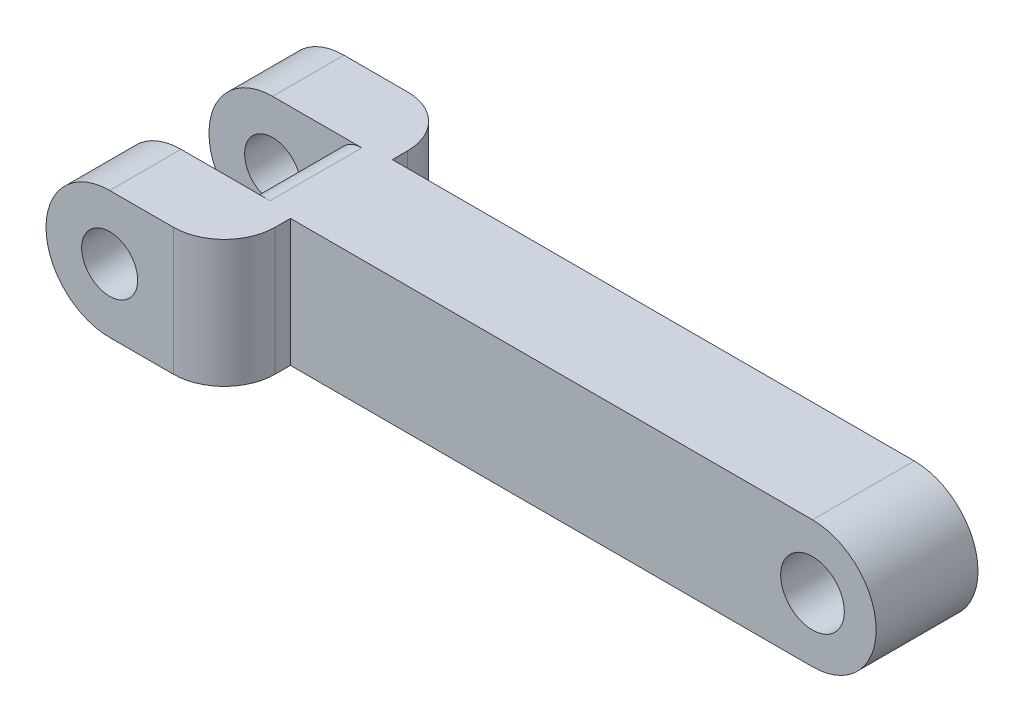
ISO-10303-21;
HEADER;
FILE_DESCRIPTION(('STEP AP214'),'2;1');
FILE_NAME('part.step','',(''),(''),'','','');
FILE_SCHEMA(('AUTOMOTIVE_DESIGN { 1 0 10303 214 1 1 1 1 }'));
ENDSEC;
DATA;
#1=APPLICATION_CONTEXT('core data for automotive mechanical design processes');
#2=APPLICATION_PROTOCOL_DEFINITION('international standard','automotive_design',2000,#1);
#3=PRODUCT_CONTEXT('',#1,'mechanical');
#4=PRODUCT('Part','Part','',(#3));
#5=PRODUCT_RELATED_PRODUCT_CATEGORY('part','',(#4));
#6=PRODUCT_DEFINITION_FORMATION('','',#4);
#7=PRODUCT_DEFINITION_CONTEXT('part definition',#1,'design');
#8=PRODUCT_DEFINITION('design','',#6,#7);
#9=PRODUCT_DEFINITION_SHAPE('','',#8);
#10=(LENGTH_UNIT() NAMED_UNIT(*) SI_UNIT(.MILLI.,.METRE.));
#11=(NAMED_UNIT(*) PLANE_ANGLE_UNIT() SI_UNIT($,.RADIAN.));
#12=(NAMED_UNIT(*) SI_UNIT($,.STERADIAN.) SOLID_ANGLE_UNIT());
#13=UNCERTAINTY_MEASURE_WITH_UNIT(LENGTH_MEASURE(1.E-05),#10,'distance_accuracy_value','');
#14=(GEOMETRIC_REPRESENTATION_CONTEXT(3) GLOBAL_UNCERTAINTY_ASSIGNED_CONTEXT((#13)) GLOBAL_UNIT_ASSIGNED_CONTEXT((#10,
#11,#12)) REPRESENTATION_CONTEXT('',''));
#15=CARTESIAN_POINT('',(0.,0.,0.));
#16=DIRECTION('',(0.,0.,1.));
#17=DIRECTION('',(1.,0.,0.));
#18=AXIS2_PLACEMENT_3D('',#15,#16,#17);
#19=CARTESIAN_POINT('',(-13.5,2.5,-2.6));
#20=DIRECTION('',(0.,1.,0.));
#21=DIRECTION('',(0.,0.,1.));
#22=AXIS2_PLACEMENT_3D('',#19,#20,#21);
#23=CYLINDRICAL_SURFACE('',#22,2.);
#24=DIRECTION('',(0.,1.,0.));
#25=VECTOR('',#24,1.);
#26=CARTESIAN_POINT('',(-11.5,2.5,-2.6));
#27=LINE('',#26,#25);
#28=CARTESIAN_POINT('',(-11.5,-2.5,-2.6));
#29=VERTEX_POINT('',#28);
#30=CARTESIAN_POINT('',(-11.5,2.5,-2.6));
#31=VERTEX_POINT('',#30);
#32=EDGE_CURVE('E249',#29,#31,#27,.T.);
#33=ORIENTED_EDGE('',*,*,#32,.F.);
#34=CARTESIAN_POINT('',(-13.5,-2.5,-2.6));
#35=DIRECTION('',(0.,-1.,0.));
#36=DIRECTION('',(0.,0.,-1.));
#37=AXIS2_PLACEMENT_3D('',#34,#35,#36);
#38=CIRCLE('',#37,2.);
#39=CARTESIAN_POINT('',(-13.5,-2.5,-4.6));
#40=VERTEX_POINT('',#39);
#41=EDGE_CURVE('E257',#40,#29,#38,.T.);
#42=ORIENTED_EDGE('',*,*,#41,.F.);
#43=DIRECTION('',(0.,1.,0.));
#44=VECTOR('',#43,1.);
#45=CARTESIAN_POINT('',(-13.5,2.5,-4.6));
#46=LINE('',#45,#44);
#47=CARTESIAN_POINT('',(-13.5,2.5,-4.6));
#48=VERTEX_POINT('',#47);
#49=EDGE_CURVE('E253',#48,#40,#46,.F.);
#50=ORIENTED_EDGE('',*,*,#49,.F.);
#51=CARTESIAN_POINT('',(-13.5,2.5,-2.6));
#52=DIRECTION('',(0.,-1.,0.));
#53=DIRECTION('',(0.,0.,-1.));
#54=AXIS2_PLACEMENT_3D('',#51,#52,#53);
#55=CIRCLE('',#54,2.);
#56=EDGE_CURVE('E260',#31,#48,#55,.F.);
#57=ORIENTED_EDGE('',*,*,#56,.F.);
#58=EDGE_LOOP('',(#33,#42,#50,#57));
#59=FACE_BOUND('',#58,.T.);
#60=ADVANCED_FACE('F40',(#59),#23,.T.);
#61=CARTESIAN_POINT('',(-13.5,2.5,2.6));
#62=DIRECTION('',(0.,1.,0.));
#63=DIRECTION('',(0.,0.,1.));
#64=AXIS2_PLACEMENT_3D('',#61,#62,#63);
#65=CYLINDRICAL_SURFACE('',#64,2.);
#66=DIRECTION('',(0.,1.,0.));
#67=VECTOR('',#66,1.);
#68=CARTESIAN_POINT('',(-13.5,2.5,4.6));
#69=LINE('',#68,#67);
#70=CARTESIAN_POINT('',(-13.5,-2.5,4.6));
#71=VERTEX_POINT('',#70);
#72=CARTESIAN_POINT('',(-13.5,2.5,4.6));
#73=VERTEX_POINT('',#72);
#74=EDGE_CURVE('E237',#71,#73,#69,.T.);
#75=ORIENTED_EDGE('',*,*,#74,.F.);
#76=CARTESIAN_POINT('',(-13.5,-2.5,2.6));
#77=DIRECTION('',(0.,-1.,0.));
#78=DIRECTION('',(0.,0.,-1.));
#79=AXIS2_PLACEMENT_3D('',#76,#77,#78);
#80=CIRCLE('',#79,2.);
#81=CARTESIAN_POINT('',(-11.5,-2.5,2.6));
#82=VERTEX_POINT('',#81);
#83=EDGE_CURVE('E244',#82,#71,#80,.T.);
#84=ORIENTED_EDGE('',*,*,#83,.F.);
#85=DIRECTION('',(0.,1.,0.));
#86=VECTOR('',#85,1.);
#87=CARTESIAN_POINT('',(-11.5,2.5,2.6));
#88=LINE('',#87,#86);
#89=CARTESIAN_POINT('',(-11.5,2.5,2.6));
#90=VERTEX_POINT('',#89);
#91=EDGE_CURVE('E241',#90,#82,#88,.F.);
#92=ORIENTED_EDGE('',*,*,#91,.F.);
#93=CARTESIAN_POINT('',(-13.5,2.5,2.6));
#94=DIRECTION('',(0.,-1.,0.));
#95=DIRECTION('',(0.,0.,-1.));
#96=AXIS2_PLACEMENT_3D('',#93,#94,#95);
#97=CIRCLE('',#96,2.);
#98=EDGE_CURVE('E160',#73,#90,#97,.F.);
#99=ORIENTED_EDGE('',*,*,#98,.F.);
#100=EDGE_LOOP('',(#75,#84,#92,#99));
#101=FACE_BOUND('',#100,.T.);
#102=ADVANCED_FACE('F386',(#101),#65,.T.);
#103=CARTESIAN_POINT('',(9.,0.,2.));
#104=DIRECTION('',(0.,0.,-1.));
#105=DIRECTION('',(-1.,0.,0.));
#106=AXIS2_PLACEMENT_3D('',#103,#104,#105);
#107=CYLINDRICAL_SURFACE('',#106,2.5);
#108=DIRECTION('',(0.,0.,-1.));
#109=VECTOR('',#108,1.);
#110=CARTESIAN_POINT('',(9.,2.5,0.));
#111=LINE('',#110,#109);
#112=CARTESIAN_POINT('',(9.,2.5,2.));
#113=VERTEX_POINT('',#112);
#114=CARTESIAN_POINT('',(9.,2.5,-2.));
#115=VERTEX_POINT('',#114);
#116=EDGE_CURVE('E225',#113,#115,#111,.T.);
#117=ORIENTED_EDGE('',*,*,#116,.F.);
#118=CARTESIAN_POINT('',(9.,0.,2.));
#119=DIRECTION('',(0.,0.,-1.));
#120=DIRECTION('',(-1.,0.,0.));
#121=AXIS2_PLACEMENT_3D('',#118,#119,#120);
#122=CIRCLE('',#121,2.5);
#123=CARTESIAN_POINT('',(9.,-2.5,2.));
#124=VERTEX_POINT('',#123);
#125=EDGE_CURVE('E173',#124,#113,#122,.F.);
#126=ORIENTED_EDGE('',*,*,#125,.F.);
#127=DIRECTION('',(0.,0.,1.));
#128=VECTOR('',#127,1.);
#129=CARTESIAN_POINT('',(9.,-2.5,2.));
#130=LINE('',#129,#128);
#131=CARTESIAN_POINT('',(9.,-2.5,-2.));
#132=VERTEX_POINT('',#131);
#133=EDGE_CURVE('E228',#132,#124,#130,.T.);
#134=ORIENTED_EDGE('',*,*,#133,.F.);
#135=CARTESIAN_POINT('',(9.,0.,-2.));
#136=DIRECTION('',(0.,0.,1.));
#137=DIRECTION('',(1.,0.,0.));
#138=AXIS2_PLACEMENT_3D('',#135,#136,#137);
#139=CIRCLE('',#138,2.5);
#140=EDGE_CURVE('E234',#115,#132,#139,.F.);
#141=ORIENTED_EDGE('',*,*,#140,.F.);
#142=EDGE_LOOP('',(#117,#126,#134,#141));
#143=FACE_BOUND('',#142,.T.);
#144=ADVANCED_FACE('F392',(#143),#107,.T.);
#145=CARTESIAN_POINT('',(-16.,0.,1.8));
#146=DIRECTION('',(0.,0.,1.));
#147=DIRECTION('',(1.,0.,0.));
#148=AXIS2_PLACEMENT_3D('',#145,#146,#147);
#149=CYLINDRICAL_SURFACE('',#148,2.5);
#150=DIRECTION('',(0.,0.,1.));
#151=VECTOR('',#150,1.);
#152=CARTESIAN_POINT('',(-16.,2.5,0.));
#153=LINE('',#152,#151);
#154=CARTESIAN_POINT('',(-16.,2.5,1.8));
#155=VERTEX_POINT('',#154);
#156=CARTESIAN_POINT('',(-16.,2.5,4.6));
#157=VERTEX_POINT('',#156);
#158=EDGE_CURVE('E211',#155,#157,#153,.T.);
#159=ORIENTED_EDGE('',*,*,#158,.F.);
#160=CARTESIAN_POINT('',(-16.,0.,1.8));
#161=DIRECTION('',(0.,0.,1.));
#162=DIRECTION('',(1.,0.,0.));
#163=AXIS2_PLACEMENT_3D('',#160,#161,#162);
#164=CIRCLE('',#163,2.5);
#165=CARTESIAN_POINT('',(-16.,-2.5,1.8));
#166=VERTEX_POINT('',#165);
#167=EDGE_CURVE('E219',#166,#155,#164,.F.);
#168=ORIENTED_EDGE('',*,*,#167,.F.);
#169=DIRECTION('',(0.,0.,-1.));
#170=VECTOR('',#169,1.);
#171=CARTESIAN_POINT('',(-16.,-2.5,1.8));
#172=LINE('',#171,#170);
#173=CARTESIAN_POINT('',(-16.,-2.5,4.6));
#174=VERTEX_POINT('',#173);
#175=EDGE_CURVE('E215',#174,#166,#172,.T.);
#176=ORIENTED_EDGE('',*,*,#175,.F.);
#177=CARTESIAN_POINT('',(-16.,0.,4.6));
#178=DIRECTION('',(0.,0.,-1.));
#179=DIRECTION('',(-1.,0.,0.));
#180=AXIS2_PLACEMENT_3D('',#177,#178,#179);
#181=CIRCLE('',#180,2.5);
#182=EDGE_CURVE('E222',#157,#174,#181,.F.);
#183=ORIENTED_EDGE('',*,*,#182,.F.);
#184=EDGE_LOOP('',(#159,#168,#176,#183));
#185=FACE_BOUND('',#184,.T.);
#186=ADVANCED_FACE('F414',(#185),#149,.T.);
#187=CARTESIAN_POINT('',(-16.,0.,-4.6));
#188=DIRECTION('',(0.,0.,1.));
#189=DIRECTION('',(1.,0.,0.));
#190=AXIS2_PLACEMENT_3D('',#187,#188,#189);
#191=CYLINDRICAL_SURFACE('',#190,2.5);
#192=DIRECTION('',(0.,0.,1.));
#193=VECTOR('',#192,1.);
#194=CARTESIAN_POINT('',(-16.,2.5,0.));
#195=LINE('',#194,#193);
#196=CARTESIAN_POINT('',(-16.,2.5,-4.6));
#197=VERTEX_POINT('',#196);
#198=CARTESIAN_POINT('',(-16.,2.5,-1.8));
#199=VERTEX_POINT('',#198);
#200=EDGE_CURVE('E183',#197,#199,#195,.T.);
#201=ORIENTED_EDGE('',*,*,#200,.F.);
#202=CARTESIAN_POINT('',(-16.,0.,-4.6));
#203=DIRECTION('',(0.,0.,1.));
#204=DIRECTION('',(1.,0.,0.));
#205=AXIS2_PLACEMENT_3D('',#202,#203,#204);
#206=CIRCLE('',#205,2.5);
#207=CARTESIAN_POINT('',(-16.,-2.5,-4.6));
#208=VERTEX_POINT('',#207);
#209=EDGE_CURVE('E204',#208,#197,#206,.F.);
#210=ORIENTED_EDGE('',*,*,#209,.F.);
#211=DIRECTION('',(0.,0.,-1.));
#212=VECTOR('',#211,1.);
#213=CARTESIAN_POINT('',(-16.,-2.5,-4.6));
#214=LINE('',#213,#212);
#215=CARTESIAN_POINT('',(-16.,-2.5,-1.8));
#216=VERTEX_POINT('',#215);
#217=EDGE_CURVE('E188',#216,#208,#214,.T.);
#218=ORIENTED_EDGE('',*,*,#217,.F.);
#219=CARTESIAN_POINT('',(-16.,0.,-1.8));
#220=DIRECTION('',(0.,0.,-1.));
#221=DIRECTION('',(-1.,0.,0.));
#222=AXIS2_PLACEMENT_3D('',#219,#220,#221);
#223=CIRCLE('',#222,2.5);
#224=EDGE_CURVE('E208',#199,#216,#223,.F.);
#225=ORIENTED_EDGE('',*,*,#224,.F.);
#226=EDGE_LOOP('',(#201,#210,#218,#225));
#227=FACE_BOUND('',#226,.T.);
#228=ADVANCED_FACE('F436',(#227),#191,.T.);
#229=CARTESIAN_POINT('',(-11.5,2.5,2.));
#230=DIRECTION('',(-1.,0.,0.));
#231=DIRECTION('',(0.,0.,1.));
#232=AXIS2_PLACEMENT_3D('',#229,#230,#231);
#233=PLANE('',#232);
#234=DIRECTION('',(0.,0.,-1.));
#235=VECTOR('',#234,1.);
#236=CARTESIAN_POINT('',(-11.5,2.5,2.));
#237=LINE('',#236,#235);
#238=CARTESIAN_POINT('',(-11.5,2.5,2.));
#239=VERTEX_POINT('',#238);
#240=EDGE_CURVE('E154',#90,#239,#237,.T.);
#241=ORIENTED_EDGE('',*,*,#240,.F.);
#242=ORIENTED_EDGE('',*,*,#91,.T.);
#243=DIRECTION('',(0.,0.,-1.));
#244=VECTOR('',#243,1.);
#245=CARTESIAN_POINT('',(-11.5,-2.5,2.));
#246=LINE('',#245,#244);
#247=CARTESIAN_POINT('',(-11.5,-2.5,2.));
#248=VERTEX_POINT('',#247);
#249=EDGE_CURVE('E180',#82,#248,#246,.T.);
#250=ORIENTED_EDGE('',*,*,#249,.T.);
#251=DIRECTION('',(0.,-1.,0.));
#252=VECTOR('',#251,1.);
#253=CARTESIAN_POINT('',(-11.5,2.5,2.));
#254=LINE('',#253,#252);
#255=EDGE_CURVE('E172',#239,#248,#254,.T.);
#256=ORIENTED_EDGE('',*,*,#255,.F.);
#257=EDGE_LOOP('',(#241,#242,#250,#256));
#258=FACE_BOUND('',#257,.T.);
#259=ADVANCED_FACE('F178',(#258),#233,.F.);
#260=CARTESIAN_POINT('',(11.5,2.5,2.));
#261=DIRECTION('',(0.,0.,-1.));
#262=DIRECTION('',(-1.,0.,0.));
#263=AXIS2_PLACEMENT_3D('',#260,#261,#262);
#264=PLANE('',#263);
#265=CARTESIAN_POINT('',(9.,0.,2.));
#266=DIRECTION('',(0.,0.,-1.));
#267=DIRECTION('',(-1.,0.,0.));
#268=AXIS2_PLACEMENT_3D('',#265,#266,#267);
#269=CIRCLE('',#268,1.25);
#270=CARTESIAN_POINT('',(7.75,0.,2.));
#271=VERTEX_POINT('',#270);
#272=EDGE_CURVE('E198',#271,#271,#269,.T.);
#273=ORIENTED_EDGE('',*,*,#272,.T.);
#274=EDGE_LOOP('',(#273));
#275=FACE_BOUND('',#274,.T.);
#276=DIRECTION('',(1.,0.,0.));
#277=VECTOR('',#276,1.);
#278=CARTESIAN_POINT('',(11.5,-2.5,2.));
#279=LINE('',#278,#277);
#280=EDGE_CURVE('E325',#248,#124,#279,.T.);
#281=ORIENTED_EDGE('',*,*,#280,.T.);
#282=ORIENTED_EDGE('',*,*,#125,.T.);
#283=DIRECTION('',(1.,0.,0.));
#284=VECTOR('',#283,1.);
#285=CARTESIAN_POINT('',(11.5,2.5,2.));
#286=LINE('',#285,#284);
#287=EDGE_CURVE('E158',#239,#113,#286,.T.);
#288=ORIENTED_EDGE('',*,*,#287,.F.);
#289=ORIENTED_EDGE('',*,*,#255,.T.);
#290=EDGE_LOOP('',(#281,#282,#288,#289));
#291=FACE_BOUND('',#290,.T.);
#292=ADVANCED_FACE('F171',(#275,#291),#264,.F.);
#293=CARTESIAN_POINT('',(11.5,2.5,-2.));
#294=DIRECTION('',(0.,0.,1.));
#295=DIRECTION('',(1.,0.,0.));
#296=AXIS2_PLACEMENT_3D('',#293,#294,#295);
#297=PLANE('',#296);
#298=CARTESIAN_POINT('',(9.,0.,-2.));
#299=DIRECTION('',(0.,0.,1.));
#300=DIRECTION('',(1.,0.,0.));
#301=AXIS2_PLACEMENT_3D('',#298,#299,#300);
#302=CIRCLE('',#301,1.25);
#303=CARTESIAN_POINT('',(10.25,0.,-2.));
#304=VERTEX_POINT('',#303);
#305=EDGE_CURVE('E195',#304,#304,#302,.T.);
#306=ORIENTED_EDGE('',*,*,#305,.T.);
#307=EDGE_LOOP('',(#306));
#308=FACE_BOUND('',#307,.T.);
#309=DIRECTION('',(-1.,0.,0.));
#310=VECTOR('',#309,1.);
#311=CARTESIAN_POINT('',(11.5,2.5,-2.));
#312=LINE('',#311,#310);
#313=CARTESIAN_POINT('',(-11.5,2.5,-2.));
#314=VERTEX_POINT('',#313);
#315=EDGE_CURVE('E176',#115,#314,#312,.T.);
#316=ORIENTED_EDGE('',*,*,#315,.F.);
#317=ORIENTED_EDGE('',*,*,#140,.T.);
#318=DIRECTION('',(-1.,0.,0.));
#319=VECTOR('',#318,1.);
#320=CARTESIAN_POINT('',(11.5,-2.5,-2.));
#321=LINE('',#320,#319);
#322=CARTESIAN_POINT('',(-11.5,-2.5,-2.));
#323=VERTEX_POINT('',#322);
#324=EDGE_CURVE('E322',#132,#323,#321,.T.);
#325=ORIENTED_EDGE('',*,*,#324,.T.);
#326=DIRECTION('',(0.,-1.,0.));
#327=VECTOR('',#326,1.);
#328=CARTESIAN_POINT('',(-11.5,2.5,-2.));
#329=LINE('',#328,#327);
#330=EDGE_CURVE('E184',#314,#323,#329,.T.);
#331=ORIENTED_EDGE('',*,*,#330,.F.);
#332=EDGE_LOOP('',(#316,#317,#325,#331));
#333=FACE_BOUND('',#332,.T.);
#334=ADVANCED_FACE('F426',(#308,#333),#297,.F.);
#335=CARTESIAN_POINT('',(-11.5,2.5,-4.6));
#336=DIRECTION('',(-1.,0.,0.));
#337=DIRECTION('',(0.,0.,1.));
#338=AXIS2_PLACEMENT_3D('',#335,#336,#337);
#339=PLANE('',#338);
#340=DIRECTION('',(0.,0.,-1.));
#341=VECTOR('',#340,1.);
#342=CARTESIAN_POINT('',(-11.5,-2.5,-4.6));
#343=LINE('',#342,#341);
#344=EDGE_CURVE('E318',#323,#29,#343,.T.);
#345=ORIENTED_EDGE('',*,*,#344,.T.);
#346=ORIENTED_EDGE('',*,*,#32,.T.);
#347=DIRECTION('',(0.,0.,-1.));
#348=VECTOR('',#347,1.);
#349=CARTESIAN_POINT('',(-11.5,2.5,-4.6));
#350=LINE('',#349,#348);
#351=EDGE_CURVE('E339',#314,#31,#350,.T.);
#352=ORIENTED_EDGE('',*,*,#351,.F.);
#353=ORIENTED_EDGE('',*,*,#330,.T.);
#354=EDGE_LOOP('',(#345,#346,#352,#353));
#355=FACE_BOUND('',#354,.T.);
#356=ADVANCED_FACE('F383',(#355),#339,.F.);
#357=CARTESIAN_POINT('',(-11.5,2.5,-4.6));
#358=DIRECTION('',(0.,0.,1.));
#359=DIRECTION('',(1.,0.,0.));
#360=AXIS2_PLACEMENT_3D('',#357,#358,#359);
#361=PLANE('',#360);
#362=CARTESIAN_POINT('',(-16.,0.,-4.6));
#363=DIRECTION('',(0.,0.,1.));
#364=DIRECTION('',(1.,0.,0.));
#365=AXIS2_PLACEMENT_3D('',#362,#363,#364);
#366=CIRCLE('',#365,1.1);
#367=CARTESIAN_POINT('',(-14.9,0.,-4.6));
#368=VERTEX_POINT('',#367);
#369=EDGE_CURVE('E355',#368,#368,#366,.T.);
#370=ORIENTED_EDGE('',*,*,#369,.T.);
#371=EDGE_LOOP('',(#370));
#372=FACE_BOUND('',#371,.T.);
#373=DIRECTION('',(-1.,0.,0.));
#374=VECTOR('',#373,1.);
#375=CARTESIAN_POINT('',(-11.5,2.5,-4.6));
#376=LINE('',#375,#374);
#377=EDGE_CURVE('E336',#48,#197,#376,.T.);
#378=ORIENTED_EDGE('',*,*,#377,.F.);
#379=ORIENTED_EDGE('',*,*,#49,.T.);
#380=DIRECTION('',(-1.,0.,0.));
#381=VECTOR('',#380,1.);
#382=CARTESIAN_POINT('',(-11.5,-2.5,-4.6));
#383=LINE('',#382,#381);
#384=EDGE_CURVE('E315',#40,#208,#383,.T.);
#385=ORIENTED_EDGE('',*,*,#384,.T.);
#386=ORIENTED_EDGE('',*,*,#209,.T.);
#387=EDGE_LOOP('',(#378,#379,#385,#386));
#388=FACE_BOUND('',#387,.T.);
#389=ADVANCED_FACE('F364',(#372,#388),#361,.F.);
#390=CARTESIAN_POINT('',(-13.5,2.5,-1.8));
#391=DIRECTION('',(0.,0.,-1.));
#392=DIRECTION('',(-1.,0.,0.));
#393=AXIS2_PLACEMENT_3D('',#390,#391,#392);
#394=PLANE('',#393);
#395=CARTESIAN_POINT('',(-16.,0.,-1.8));
#396=DIRECTION('',(0.,0.,-1.));
#397=DIRECTION('',(-1.,0.,0.));
#398=AXIS2_PLACEMENT_3D('',#395,#396,#397);
#399=CIRCLE('',#398,1.1);
#400=CARTESIAN_POINT('',(-17.1,0.,-1.8));
#401=VERTEX_POINT('',#400);
#402=EDGE_CURVE('E199',#401,#401,#399,.T.);
#403=ORIENTED_EDGE('',*,*,#402,.T.);
#404=EDGE_LOOP('',(#403));
#405=FACE_BOUND('',#404,.T.);
#406=DIRECTION('',(1.,0.,0.));
#407=VECTOR('',#406,1.);
#408=CARTESIAN_POINT('',(-13.5,2.5,-1.8));
#409=LINE('',#408,#407);
#410=CARTESIAN_POINT('',(-12.5,2.5,-1.8));
#411=VERTEX_POINT('',#410);
#412=EDGE_CURVE('E64',#199,#411,#409,.T.);
#413=ORIENTED_EDGE('',*,*,#412,.F.);
#414=ORIENTED_EDGE('',*,*,#224,.T.);
#415=DIRECTION('',(1.,0.,0.));
#416=VECTOR('',#415,1.);
#417=CARTESIAN_POINT('',(-13.5,-2.5,-1.8));
#418=LINE('',#417,#416);
#419=CARTESIAN_POINT('',(-12.5,-2.5,-1.8));
#420=VERTEX_POINT('',#419);
#421=EDGE_CURVE('E312',#216,#420,#418,.T.);
#422=ORIENTED_EDGE('',*,*,#421,.T.);
#423=CARTESIAN_POINT('',(-12.5,-1.5,-1.8));
#424=DIRECTION('',(0.,0.,-1.));
#425=DIRECTION('',(-1.,0.,0.));
#426=AXIS2_PLACEMENT_3D('',#423,#424,#425);
#427=CIRCLE('',#426,1.);
#428=CARTESIAN_POINT('',(-13.5,-1.5,-1.8));
#429=VERTEX_POINT('',#428);
#430=EDGE_CURVE('E281',#420,#429,#427,.T.);
#431=ORIENTED_EDGE('',*,*,#430,.T.);
#432=DIRECTION('',(0.,-1.,0.));
#433=VECTOR('',#432,1.);
#434=CARTESIAN_POINT('',(-13.5,2.5,-1.8));
#435=LINE('',#434,#433);
#436=CARTESIAN_POINT('',(-13.5,1.5,-1.8));
#437=VERTEX_POINT('',#436);
#438=EDGE_CURVE('E191',#437,#429,#435,.T.);
#439=ORIENTED_EDGE('',*,*,#438,.F.);
#440=CARTESIAN_POINT('',(-12.5,1.5,-1.8));
#441=DIRECTION('',(0.,0.,-1.));
#442=DIRECTION('',(-1.,0.,0.));
#443=AXIS2_PLACEMENT_3D('',#440,#441,#442);
#444=CIRCLE('',#443,1.);
#445=EDGE_CURVE('E11',#437,#411,#444,.T.);
#446=ORIENTED_EDGE('',*,*,#445,.T.);
#447=EDGE_LOOP('',(#413,#414,#422,#431,#439,#446));
#448=FACE_BOUND('',#447,.T.);
#449=ADVANCED_FACE('F302',(#405,#448),#394,.F.);
#450=CARTESIAN_POINT('',(-13.5,2.5,-1.8));
#451=DIRECTION('',(1.,0.,0.));
#452=DIRECTION('',(0.,0.,-1.));
#453=AXIS2_PLACEMENT_3D('',#450,#451,#452);
#454=PLANE('',#453);
#455=ORIENTED_EDGE('',*,*,#438,.T.);
#456=DIRECTION('',(0.,0.,1.));
#457=VECTOR('',#456,1.);
#458=CARTESIAN_POINT('',(-13.5,-1.5,1.8));
#459=LINE('',#458,#457);
#460=CARTESIAN_POINT('',(-13.5,-1.5,1.8));
#461=VERTEX_POINT('',#460);
#462=EDGE_CURVE('E266',#429,#461,#459,.T.);
#463=ORIENTED_EDGE('',*,*,#462,.T.);
#464=DIRECTION('',(0.,-1.,0.));
#465=VECTOR('',#464,1.);
#466=CARTESIAN_POINT('',(-13.5,2.5,1.8));
#467=LINE('',#466,#465);
#468=CARTESIAN_POINT('',(-13.5,1.5,1.8));
#469=VERTEX_POINT('',#468);
#470=EDGE_CURVE('E288',#469,#461,#467,.T.);
#471=ORIENTED_EDGE('',*,*,#470,.F.);
#472=DIRECTION('',(0.,0.,1.));
#473=VECTOR('',#472,1.);
#474=CARTESIAN_POINT('',(-13.5,1.5,-1.8));
#475=LINE('',#474,#473);
#476=EDGE_CURVE('E263',#469,#437,#475,.F.);
#477=ORIENTED_EDGE('',*,*,#476,.T.);
#478=EDGE_LOOP('',(#455,#463,#471,#477));
#479=FACE_BOUND('',#478,.T.);
#480=ADVANCED_FACE('F294',(#479),#454,.F.);
#481=CARTESIAN_POINT('',(-13.5,2.5,1.8));
#482=DIRECTION('',(0.,0.,1.));
#483=DIRECTION('',(1.,0.,0.));
#484=AXIS2_PLACEMENT_3D('',#481,#482,#483);
#485=PLANE('',#484);
#486=CARTESIAN_POINT('',(-16.,0.,1.8));
#487=DIRECTION('',(0.,0.,1.));
#488=DIRECTION('',(1.,0.,0.));
#489=AXIS2_PLACEMENT_3D('',#486,#487,#488);
#490=CIRCLE('',#489,1.1);
#491=CARTESIAN_POINT('',(-14.9,0.,1.8));
#492=VERTEX_POINT('',#491);
#493=EDGE_CURVE('E351',#492,#492,#490,.T.);
#494=ORIENTED_EDGE('',*,*,#493,.T.);
#495=EDGE_LOOP('',(#494));
#496=FACE_BOUND('',#495,.T.);
#497=DIRECTION('',(-1.,0.,0.));
#498=VECTOR('',#497,1.);
#499=CARTESIAN_POINT('',(-13.5,-2.5,1.8));
#500=LINE('',#499,#498);
#501=CARTESIAN_POINT('',(-12.5,-2.5,1.8));
#502=VERTEX_POINT('',#501);
#503=EDGE_CURVE('E309',#502,#166,#500,.T.);
#504=ORIENTED_EDGE('',*,*,#503,.T.);
#505=ORIENTED_EDGE('',*,*,#167,.T.);
#506=DIRECTION('',(-1.,0.,0.));
#507=VECTOR('',#506,1.);
#508=CARTESIAN_POINT('',(-13.5,2.5,1.8));
#509=LINE('',#508,#507);
#510=CARTESIAN_POINT('',(-12.5,2.5,1.8));
#511=VERTEX_POINT('',#510);
#512=EDGE_CURVE('E56',#511,#155,#509,.T.);
#513=ORIENTED_EDGE('',*,*,#512,.F.);
#514=CARTESIAN_POINT('',(-12.5,1.5,1.8));
#515=DIRECTION('',(0.,0.,1.));
#516=DIRECTION('',(1.,0.,0.));
#517=AXIS2_PLACEMENT_3D('',#514,#515,#516);
#518=CIRCLE('',#517,1.);
#519=EDGE_CURVE('E49',#511,#469,#518,.T.);
#520=ORIENTED_EDGE('',*,*,#519,.T.);
#521=ORIENTED_EDGE('',*,*,#470,.T.);
#522=CARTESIAN_POINT('',(-12.5,-1.5,1.8));
#523=DIRECTION('',(0.,0.,1.));
#524=DIRECTION('',(1.,0.,0.));
#525=AXIS2_PLACEMENT_3D('',#522,#523,#524);
#526=CIRCLE('',#525,1.);
#527=EDGE_CURVE('E277',#461,#502,#526,.T.);
#528=ORIENTED_EDGE('',*,*,#527,.T.);
#529=EDGE_LOOP('',(#504,#505,#513,#520,#521,#528));
#530=FACE_BOUND('',#529,.T.);
#531=ADVANCED_FACE('F287',(#496,#530),#485,.F.);
#532=CARTESIAN_POINT('',(-11.5,2.5,4.6));
#533=DIRECTION('',(0.,0.,-1.));
#534=DIRECTION('',(-1.,0.,0.));
#535=AXIS2_PLACEMENT_3D('',#532,#533,#534);
#536=PLANE('',#535);
#537=CARTESIAN_POINT('',(-16.,0.,4.6));
#538=DIRECTION('',(0.,0.,1.));
#539=DIRECTION('',(1.,0.,0.));
#540=AXIS2_PLACEMENT_3D('',#537,#538,#539);
#541=CIRCLE('',#540,1.1);
#542=CARTESIAN_POINT('',(-14.9,0.,4.6));
#543=VERTEX_POINT('',#542);
#544=EDGE_CURVE('E356',#543,#543,#541,.T.);
#545=ORIENTED_EDGE('',*,*,#544,.F.);
#546=EDGE_LOOP('',(#545));
#547=FACE_BOUND('',#546,.T.);
#548=DIRECTION('',(1.,0.,0.));
#549=VECTOR('',#548,1.);
#550=CARTESIAN_POINT('',(-11.5,-2.5,4.6));
#551=LINE('',#550,#549);
#552=EDGE_CURVE('E166',#174,#71,#551,.T.);
#553=ORIENTED_EDGE('',*,*,#552,.T.);
#554=ORIENTED_EDGE('',*,*,#74,.T.);
#555=DIRECTION('',(1.,0.,0.));
#556=VECTOR('',#555,1.);
#557=CARTESIAN_POINT('',(-11.5,2.5,4.6));
#558=LINE('',#557,#556);
#559=EDGE_CURVE('E298',#157,#73,#558,.T.);
#560=ORIENTED_EDGE('',*,*,#559,.F.);
#561=ORIENTED_EDGE('',*,*,#182,.T.);
#562=EDGE_LOOP('',(#553,#554,#560,#561));
#563=FACE_BOUND('',#562,.T.);
#564=ADVANCED_FACE('F417',(#547,#563),#536,.F.);
#565=CARTESIAN_POINT('',(0.,2.5,0.));
#566=DIRECTION('',(0.,-1.,0.));
#567=DIRECTION('',(0.,0.,-1.));
#568=AXIS2_PLACEMENT_3D('',#565,#566,#567);
#569=PLANE('',#568);
#570=DIRECTION('',(0.,0.,1.));
#571=VECTOR('',#570,1.);
#572=CARTESIAN_POINT('',(-12.5,2.5,0.));
#573=LINE('',#572,#571);
#574=EDGE_CURVE('E274',#411,#511,#573,.T.);
#575=ORIENTED_EDGE('',*,*,#574,.T.);
#576=ORIENTED_EDGE('',*,*,#512,.T.);
#577=ORIENTED_EDGE('',*,*,#158,.T.);
#578=ORIENTED_EDGE('',*,*,#559,.T.);
#579=ORIENTED_EDGE('',*,*,#98,.T.);
#580=ORIENTED_EDGE('',*,*,#240,.T.);
#581=ORIENTED_EDGE('',*,*,#287,.T.);
#582=ORIENTED_EDGE('',*,*,#116,.T.);
#583=ORIENTED_EDGE('',*,*,#315,.T.);
#584=ORIENTED_EDGE('',*,*,#351,.T.);
#585=ORIENTED_EDGE('',*,*,#56,.T.);
#586=ORIENTED_EDGE('',*,*,#377,.T.);
#587=ORIENTED_EDGE('',*,*,#200,.T.);
#588=ORIENTED_EDGE('',*,*,#412,.T.);
#589=EDGE_LOOP('',(#575,#576,#577,#578,#579,#580,#581,#582,#583,#584,#585,#586,#587,#588));
#590=FACE_BOUND('',#589,.T.);
#591=ADVANCED_FACE('F156',(#590),#569,.F.);
#592=CARTESIAN_POINT('',(0.,-2.5,0.));
#593=DIRECTION('',(0.,-1.,0.));
#594=DIRECTION('',(0.,0.,-1.));
#595=AXIS2_PLACEMENT_3D('',#592,#593,#594);
#596=PLANE('',#595);
#597=ORIENTED_EDGE('',*,*,#503,.F.);
#598=DIRECTION('',(0.,0.,1.));
#599=VECTOR('',#598,1.);
#600=CARTESIAN_POINT('',(-12.5,-2.5,-1.8));
#601=LINE('',#600,#599);
#602=EDGE_CURVE('E270',#502,#420,#601,.F.);
#603=ORIENTED_EDGE('',*,*,#602,.T.);
#604=ORIENTED_EDGE('',*,*,#421,.F.);
#605=ORIENTED_EDGE('',*,*,#217,.T.);
#606=ORIENTED_EDGE('',*,*,#384,.F.);
#607=ORIENTED_EDGE('',*,*,#41,.T.);
#608=ORIENTED_EDGE('',*,*,#344,.F.);
#609=ORIENTED_EDGE('',*,*,#324,.F.);
#610=ORIENTED_EDGE('',*,*,#133,.T.);
#611=ORIENTED_EDGE('',*,*,#280,.F.);
#612=ORIENTED_EDGE('',*,*,#249,.F.);
#613=ORIENTED_EDGE('',*,*,#83,.T.);
#614=ORIENTED_EDGE('',*,*,#552,.F.);
#615=ORIENTED_EDGE('',*,*,#175,.T.);
#616=EDGE_LOOP('',(#597,#603,#604,#605,#606,#607,#608,#609,#610,#611,#612,#613,#614,#615));
#617=FACE_BOUND('',#616,.T.);
#618=ADVANCED_FACE('F409',(#617),#596,.T.);
#619=CARTESIAN_POINT('',(-16.,0.,-4.6));
#620=DIRECTION('',(0.,0.,1.));
#621=DIRECTION('',(1.,0.,0.));
#622=AXIS2_PLACEMENT_3D('',#619,#620,#621);
#623=CYLINDRICAL_SURFACE('',#622,1.1);
#624=ORIENTED_EDGE('',*,*,#544,.T.);
#625=EDGE_LOOP('',(#624));
#626=FACE_BOUND('',#625,.T.);
#627=ORIENTED_EDGE('',*,*,#493,.F.);
#628=EDGE_LOOP('',(#627));
#629=FACE_BOUND('',#628,.T.);
#630=ADVANCED_FACE('F371',(#626,#629),#623,.F.);
#631=ORIENTED_EDGE('',*,*,#369,.F.);
#632=EDGE_LOOP('',(#631));
#633=FACE_BOUND('',#632,.T.);
#634=ORIENTED_EDGE('',*,*,#402,.F.);
#635=EDGE_LOOP('',(#634));
#636=FACE_BOUND('',#635,.T.);
#637=ADVANCED_FACE('F367',(#633,#636),#623,.F.);
#638=CARTESIAN_POINT('',(9.,0.,-4.6));
#639=DIRECTION('',(0.,0.,1.));
#640=DIRECTION('',(1.,0.,0.));
#641=AXIS2_PLACEMENT_3D('',#638,#639,#640);
#642=CYLINDRICAL_SURFACE('',#641,1.25);
#643=ORIENTED_EDGE('',*,*,#305,.F.);
#644=EDGE_LOOP('',(#643));
#645=FACE_BOUND('',#644,.T.);
#646=ORIENTED_EDGE('',*,*,#272,.F.);
#647=EDGE_LOOP('',(#646));
#648=FACE_BOUND('',#647,.T.);
#649=ADVANCED_FACE('F370',(#645,#648),#642,.F.);
#650=CARTESIAN_POINT('',(-12.5,-1.5,-1.8));
#651=DIRECTION('',(0.,0.,-1.));
#652=DIRECTION('',(-1.,0.,0.));
#653=AXIS2_PLACEMENT_3D('',#650,#651,#652);
#654=CYLINDRICAL_SURFACE('',#653,1.);
#655=ORIENTED_EDGE('',*,*,#430,.F.);
#656=ORIENTED_EDGE('',*,*,#602,.F.);
#657=ORIENTED_EDGE('',*,*,#527,.F.);
#658=ORIENTED_EDGE('',*,*,#462,.F.);
#659=EDGE_LOOP('',(#655,#656,#657,#658));
#660=FACE_BOUND('',#659,.T.);
#661=ADVANCED_FACE('F397',(#660),#654,.T.);
#662=CARTESIAN_POINT('',(-12.5,1.5,0.));
#663=DIRECTION('',(0.,0.,1.));
#664=DIRECTION('',(1.,0.,0.));
#665=AXIS2_PLACEMENT_3D('',#662,#663,#664);
#666=CYLINDRICAL_SURFACE('',#665,1.);
#667=ORIENTED_EDGE('',*,*,#445,.F.);
#668=ORIENTED_EDGE('',*,*,#476,.F.);
#669=ORIENTED_EDGE('',*,*,#519,.F.);
#670=ORIENTED_EDGE('',*,*,#574,.F.);
#671=EDGE_LOOP('',(#667,#668,#669,#670));
#672=FACE_BOUND('',#671,.T.);
#673=ADVANCED_FACE('F42',(#672),#666,.T.);
#674=CLOSED_SHELL('',(#60,#102,#144,#186,#228,#259,#292,#334,#356,#389,#449,#480,#531,#564,#591,
#618,#630,#637,#649,#661,#673));
#675=MANIFOLD_SOLID_BREP('B2',#674);
#676=ADVANCED_BREP_SHAPE_REPRESENTATION('',(#18,#675),#14);
#677=SHAPE_DEFINITION_REPRESENTATION(#9,#676);
ENDSEC;
END-ISO-10303-21;
